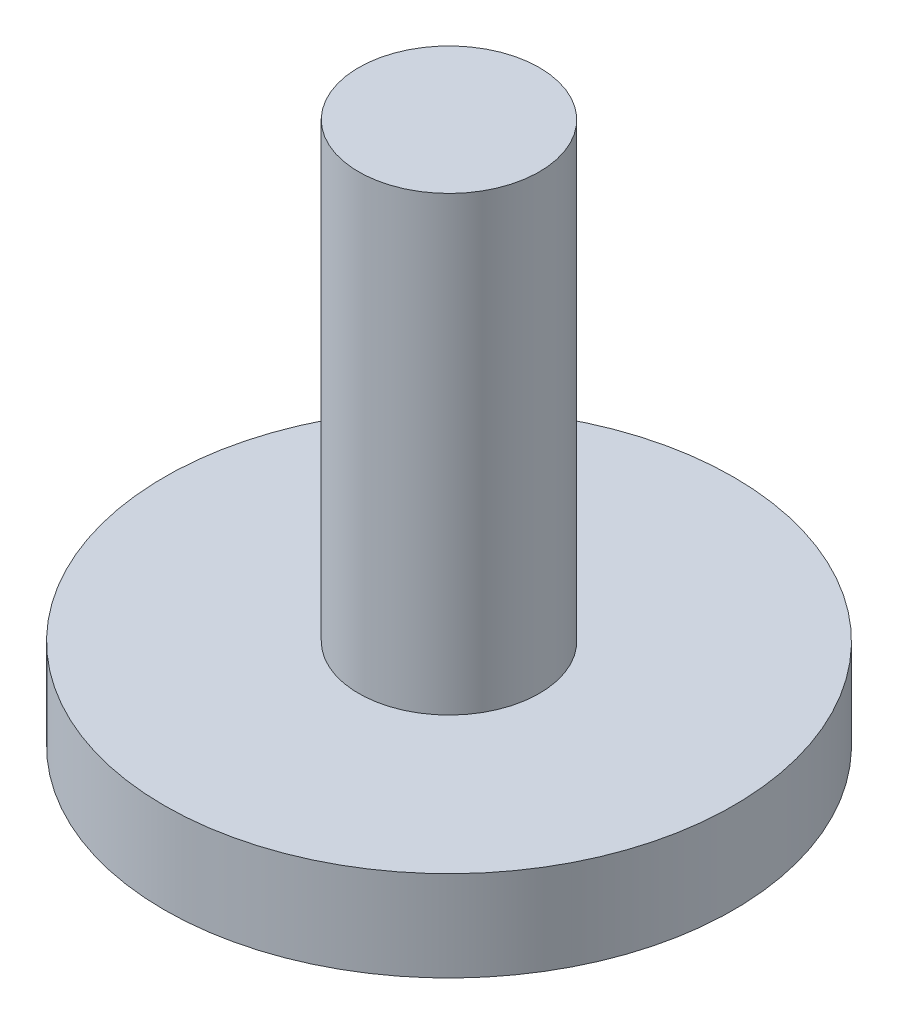
ISO-10303-21;
HEADER;
FILE_DESCRIPTION(('STEP AP214'),'2;1');
FILE_NAME('part.step','',(''),(''),'','','');
FILE_SCHEMA(('AUTOMOTIVE_DESIGN { 1 0 10303 214 1 1 1 1 }'));
ENDSEC;
DATA;
#1=APPLICATION_CONTEXT('core data for automotive mechanical design processes');
#2=APPLICATION_PROTOCOL_DEFINITION('international standard','automotive_design',2000,#1);
#3=PRODUCT_CONTEXT('',#1,'mechanical');
#4=PRODUCT('Part','Part','',(#3));
#5=PRODUCT_RELATED_PRODUCT_CATEGORY('part','',(#4));
#6=PRODUCT_DEFINITION_FORMATION('','',#4);
#7=PRODUCT_DEFINITION_CONTEXT('part definition',#1,'design');
#8=PRODUCT_DEFINITION('design','',#6,#7);
#9=PRODUCT_DEFINITION_SHAPE('','',#8);
#10=(LENGTH_UNIT() NAMED_UNIT(*) SI_UNIT(.MILLI.,.METRE.));
#11=(NAMED_UNIT(*) PLANE_ANGLE_UNIT() SI_UNIT($,.RADIAN.));
#12=(NAMED_UNIT(*) SI_UNIT($,.STERADIAN.) SOLID_ANGLE_UNIT());
#13=UNCERTAINTY_MEASURE_WITH_UNIT(LENGTH_MEASURE(1.E-05),#10,'distance_accuracy_value','');
#14=(GEOMETRIC_REPRESENTATION_CONTEXT(3) GLOBAL_UNCERTAINTY_ASSIGNED_CONTEXT((#13)) GLOBAL_UNIT_ASSIGNED_CONTEXT((#10,
#11,#12)) REPRESENTATION_CONTEXT('',''));
#15=CARTESIAN_POINT('',(0.,0.,0.));
#16=DIRECTION('',(0.,0.,1.));
#17=DIRECTION('',(1.,0.,0.));
#18=AXIS2_PLACEMENT_3D('',#15,#16,#17);
#19=CARTESIAN_POINT('',(0.,0.,0.));
#20=DIRECTION('',(0.,1.,0.));
#21=DIRECTION('',(0.,0.,1.));
#22=AXIS2_PLACEMENT_3D('',#19,#20,#21);
#23=PLANE('',#22);
#24=CARTESIAN_POINT('',(0.,0.,0.));
#25=DIRECTION('',(0.,-1.,0.));
#26=DIRECTION('',(0.,0.,-1.));
#27=AXIS2_PLACEMENT_3D('',#24,#25,#26);
#28=CIRCLE('',#27,15.75);
#29=CARTESIAN_POINT('',(0.,0.,-15.75));
#30=VERTEX_POINT('',#29);
#31=EDGE_CURVE('E10',#30,#30,#28,.T.);
#32=ORIENTED_EDGE('',*,*,#31,.T.);
#33=EDGE_LOOP('',(#32));
#34=FACE_BOUND('',#33,.T.);
#35=ADVANCED_FACE('F31',(#34),#23,.F.);
#36=CARTESIAN_POINT('',(0.,0.,0.));
#37=DIRECTION('',(0.,-1.,0.));
#38=DIRECTION('',(0.,0.,-1.));
#39=AXIS2_PLACEMENT_3D('',#36,#37,#38);
#40=CYLINDRICAL_SURFACE('',#39,15.75);
#41=ORIENTED_EDGE('',*,*,#31,.F.);
#42=EDGE_LOOP('',(#41));
#43=FACE_BOUND('',#42,.T.);
#44=CARTESIAN_POINT('',(0.,5.,0.));
#45=DIRECTION('',(0.,-1.,0.));
#46=DIRECTION('',(0.,0.,-1.));
#47=AXIS2_PLACEMENT_3D('',#44,#45,#46);
#48=CIRCLE('',#47,15.75);
#49=CARTESIAN_POINT('',(0.,5.,-15.75));
#50=VERTEX_POINT('',#49);
#51=EDGE_CURVE('E37',#50,#50,#48,.T.);
#52=ORIENTED_EDGE('',*,*,#51,.T.);
#53=EDGE_LOOP('',(#52));
#54=FACE_BOUND('',#53,.T.);
#55=ADVANCED_FACE('F63',(#43,#54),#40,.T.);
#56=CARTESIAN_POINT('',(-15.75,5.,0.));
#57=DIRECTION('',(0.,-1.,0.));
#58=DIRECTION('',(0.,0.,-1.));
#59=AXIS2_PLACEMENT_3D('',#56,#57,#58);
#60=PLANE('',#59);
#61=ORIENTED_EDGE('',*,*,#51,.F.);
#62=EDGE_LOOP('',(#61));
#63=FACE_BOUND('',#62,.T.);
#64=CARTESIAN_POINT('',(0.,5.,0.));
#65=DIRECTION('',(0.,-1.,0.));
#66=DIRECTION('',(0.,0.,-1.));
#67=AXIS2_PLACEMENT_3D('',#64,#65,#66);
#68=CIRCLE('',#67,5.);
#69=CARTESIAN_POINT('',(0.,5.,-5.));
#70=VERTEX_POINT('',#69);
#71=EDGE_CURVE('E41',#70,#70,#68,.T.);
#72=ORIENTED_EDGE('',*,*,#71,.T.);
#73=EDGE_LOOP('',(#72));
#74=FACE_BOUND('',#73,.T.);
#75=ADVANCED_FACE('F59',(#63,#74),#60,.F.);
#76=CARTESIAN_POINT('',(0.,0.,0.));
#77=DIRECTION('',(0.,-1.,0.));
#78=DIRECTION('',(0.,0.,-1.));
#79=AXIS2_PLACEMENT_3D('',#76,#77,#78);
#80=CYLINDRICAL_SURFACE('',#79,5.);
#81=ORIENTED_EDGE('',*,*,#71,.F.);
#82=EDGE_LOOP('',(#81));
#83=FACE_BOUND('',#82,.T.);
#84=CARTESIAN_POINT('',(0.,30.,0.));
#85=DIRECTION('',(0.,-1.,0.));
#86=DIRECTION('',(0.,0.,-1.));
#87=AXIS2_PLACEMENT_3D('',#84,#85,#86);
#88=CIRCLE('',#87,5.);
#89=CARTESIAN_POINT('',(0.,30.,-5.));
#90=VERTEX_POINT('',#89);
#91=EDGE_CURVE('E45',#90,#90,#88,.T.);
#92=ORIENTED_EDGE('',*,*,#91,.T.);
#93=EDGE_LOOP('',(#92));
#94=FACE_BOUND('',#93,.T.);
#95=ADVANCED_FACE('F51',(#83,#94),#80,.T.);
#96=CARTESIAN_POINT('',(-5.,30.,0.));
#97=DIRECTION('',(0.,-1.,0.));
#98=DIRECTION('',(0.,0.,-1.));
#99=AXIS2_PLACEMENT_3D('',#96,#97,#98);
#100=PLANE('',#99);
#101=ORIENTED_EDGE('',*,*,#91,.F.);
#102=EDGE_LOOP('',(#101));
#103=FACE_BOUND('',#102,.T.);
#104=ADVANCED_FACE('F53',(#103),#100,.F.);
#105=CLOSED_SHELL('',(#35,#55,#75,#95,#104));
#106=MANIFOLD_SOLID_BREP('B2',#105);
#107=ADVANCED_BREP_SHAPE_REPRESENTATION('',(#18,#106),#14);
#108=SHAPE_DEFINITION_REPRESENTATION(#9,#107);
ENDSEC;
END-ISO-10303-21;
